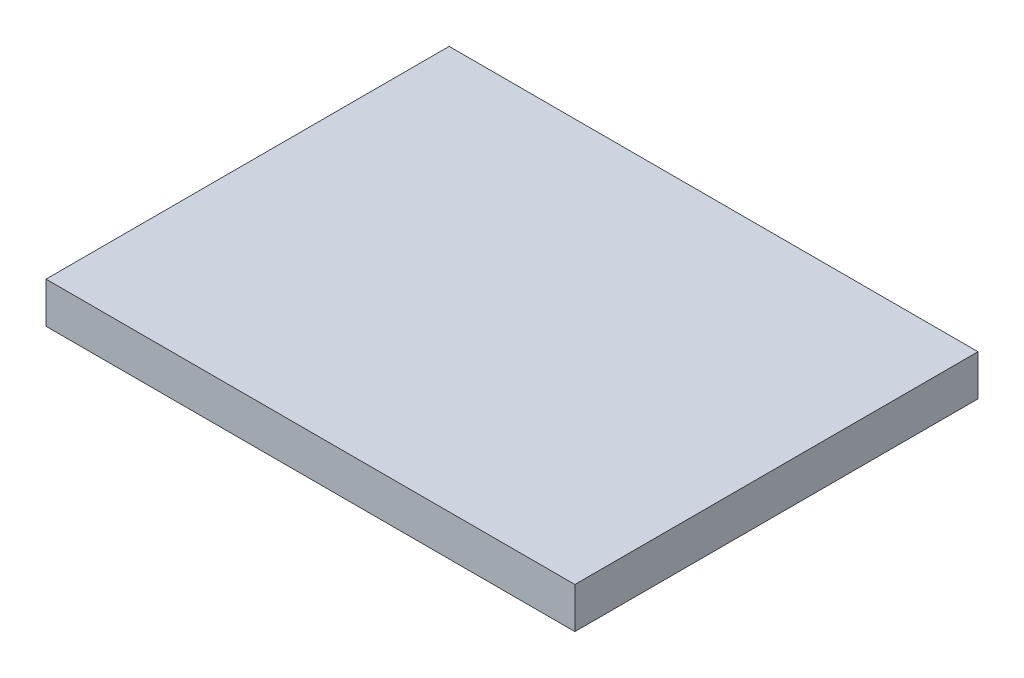
ISO-10303-21;
HEADER;
FILE_DESCRIPTION(('STEP AP214'),'2;1');
FILE_NAME('part.step','',(''),(''),'','','');
FILE_SCHEMA(('AUTOMOTIVE_DESIGN { 1 0 10303 214 1 1 1 1 }'));
ENDSEC;
DATA;
#1=APPLICATION_CONTEXT('core data for automotive mechanical design processes');
#2=APPLICATION_PROTOCOL_DEFINITION('international standard','automotive_design',2000,#1);
#3=PRODUCT_CONTEXT('',#1,'mechanical');
#4=PRODUCT('Part','Part','',(#3));
#5=PRODUCT_RELATED_PRODUCT_CATEGORY('part','',(#4));
#6=PRODUCT_DEFINITION_FORMATION('','',#4);
#7=PRODUCT_DEFINITION_CONTEXT('part definition',#1,'design');
#8=PRODUCT_DEFINITION('design','',#6,#7);
#9=PRODUCT_DEFINITION_SHAPE('','',#8);
#10=(LENGTH_UNIT() NAMED_UNIT(*) SI_UNIT(.MILLI.,.METRE.));
#11=(NAMED_UNIT(*) PLANE_ANGLE_UNIT() SI_UNIT($,.RADIAN.));
#12=(NAMED_UNIT(*) SI_UNIT($,.STERADIAN.) SOLID_ANGLE_UNIT());
#13=UNCERTAINTY_MEASURE_WITH_UNIT(LENGTH_MEASURE(1.E-05),#10,'distance_accuracy_value','');
#14=(GEOMETRIC_REPRESENTATION_CONTEXT(3) GLOBAL_UNCERTAINTY_ASSIGNED_CONTEXT((#13)) GLOBAL_UNIT_ASSIGNED_CONTEXT((#10,
#11,#12)) REPRESENTATION_CONTEXT('',''));
#15=CARTESIAN_POINT('',(0.,0.,0.));
#16=DIRECTION('',(0.,0.,1.));
#17=DIRECTION('',(1.,0.,0.));
#18=AXIS2_PLACEMENT_3D('',#15,#16,#17);
#19=CARTESIAN_POINT('',(64.7574629951211,10.,49.3605836815958));
#20=DIRECTION('',(-1.,0.,0.));
#21=DIRECTION('',(0.,0.,1.));
#22=AXIS2_PLACEMENT_3D('',#19,#20,#21);
#23=PLANE('',#22);
#24=DIRECTION('',(0.,0.,-1.));
#25=VECTOR('',#24,1.);
#26=CARTESIAN_POINT('',(64.7574629951211,0.,49.3605836815958));
#27=LINE('',#26,#25);
#28=CARTESIAN_POINT('',(64.7574629951211,0.,49.3605836815958));
#29=VERTEX_POINT('',#28);
#30=CARTESIAN_POINT('',(64.7574629951211,0.,-49.3605836815958));
#31=VERTEX_POINT('',#30);
#32=EDGE_CURVE('E100',#29,#31,#27,.T.);
#33=ORIENTED_EDGE('',*,*,#32,.T.);
#34=DIRECTION('',(0.,-1.,0.));
#35=VECTOR('',#34,1.);
#36=CARTESIAN_POINT('',(64.7574629951211,10.,-49.3605836815958));
#37=LINE('',#36,#35);
#38=CARTESIAN_POINT('',(64.7574629951211,10.,-49.3605836815958));
#39=VERTEX_POINT('',#38);
#40=EDGE_CURVE('E11',#39,#31,#37,.T.);
#41=ORIENTED_EDGE('',*,*,#40,.F.);
#42=DIRECTION('',(0.,0.,-1.));
#43=VECTOR('',#42,1.);
#44=CARTESIAN_POINT('',(64.7574629951211,10.,49.3605836815958));
#45=LINE('',#44,#43);
#46=CARTESIAN_POINT('',(64.7574629951211,10.,49.3605836815958));
#47=VERTEX_POINT('',#46);
#48=EDGE_CURVE('E88',#47,#39,#45,.T.);
#49=ORIENTED_EDGE('',*,*,#48,.F.);
#50=DIRECTION('',(0.,-1.,0.));
#51=VECTOR('',#50,1.);
#52=CARTESIAN_POINT('',(64.7574629951211,10.,49.3605836815958));
#53=LINE('',#52,#51);
#54=EDGE_CURVE('E96',#47,#29,#53,.T.);
#55=ORIENTED_EDGE('',*,*,#54,.T.);
#56=EDGE_LOOP('',(#33,#41,#49,#55));
#57=FACE_BOUND('',#56,.T.);
#58=ADVANCED_FACE('F37',(#57),#23,.F.);
#59=CARTESIAN_POINT('',(-64.7574629951211,10.,-49.3605836815958));
#60=DIRECTION('',(0.,0.,1.));
#61=DIRECTION('',(1.,0.,0.));
#62=AXIS2_PLACEMENT_3D('',#59,#60,#61);
#63=PLANE('',#62);
#64=DIRECTION('',(-1.,0.,0.));
#65=VECTOR('',#64,1.);
#66=CARTESIAN_POINT('',(-64.7574629951211,0.,-49.3605836815958));
#67=LINE('',#66,#65);
#68=CARTESIAN_POINT('',(-64.7574629951211,0.,-49.3605836815958));
#69=VERTEX_POINT('',#68);
#70=EDGE_CURVE('E92',#31,#69,#67,.T.);
#71=ORIENTED_EDGE('',*,*,#70,.T.);
#72=DIRECTION('',(0.,-1.,0.));
#73=VECTOR('',#72,1.);
#74=CARTESIAN_POINT('',(-64.7574629951211,10.,-49.3605836815958));
#75=LINE('',#74,#73);
#76=CARTESIAN_POINT('',(-64.7574629951211,10.,-49.3605836815958));
#77=VERTEX_POINT('',#76);
#78=EDGE_CURVE('E45',#77,#69,#75,.T.);
#79=ORIENTED_EDGE('',*,*,#78,.F.);
#80=DIRECTION('',(-1.,0.,0.));
#81=VECTOR('',#80,1.);
#82=CARTESIAN_POINT('',(-64.7574629951211,10.,-49.3605836815958));
#83=LINE('',#82,#81);
#84=EDGE_CURVE('E83',#39,#77,#83,.T.);
#85=ORIENTED_EDGE('',*,*,#84,.F.);
#86=ORIENTED_EDGE('',*,*,#40,.T.);
#87=EDGE_LOOP('',(#71,#79,#85,#86));
#88=FACE_BOUND('',#87,.T.);
#89=ADVANCED_FACE('F91',(#88),#63,.F.);
#90=CARTESIAN_POINT('',(-64.7574629951211,10.,49.3605836815958));
#91=DIRECTION('',(1.,0.,0.));
#92=DIRECTION('',(0.,0.,-1.));
#93=AXIS2_PLACEMENT_3D('',#90,#91,#92);
#94=PLANE('',#93);
#95=DIRECTION('',(0.,0.,1.));
#96=VECTOR('',#95,1.);
#97=CARTESIAN_POINT('',(-64.7574629951211,0.,49.3605836815958));
#98=LINE('',#97,#96);
#99=CARTESIAN_POINT('',(-64.7574629951211,0.,49.3605836815958));
#100=VERTEX_POINT('',#99);
#101=EDGE_CURVE('E70',#69,#100,#98,.T.);
#102=ORIENTED_EDGE('',*,*,#101,.T.);
#103=DIRECTION('',(0.,-1.,0.));
#104=VECTOR('',#103,1.);
#105=CARTESIAN_POINT('',(-64.7574629951211,10.,49.3605836815958));
#106=LINE('',#105,#104);
#107=CARTESIAN_POINT('',(-64.7574629951211,10.,49.3605836815958));
#108=VERTEX_POINT('',#107);
#109=EDGE_CURVE('E93',#108,#100,#106,.T.);
#110=ORIENTED_EDGE('',*,*,#109,.F.);
#111=DIRECTION('',(0.,0.,1.));
#112=VECTOR('',#111,1.);
#113=CARTESIAN_POINT('',(-64.7574629951211,10.,49.3605836815958));
#114=LINE('',#113,#112);
#115=EDGE_CURVE('E86',#77,#108,#114,.T.);
#116=ORIENTED_EDGE('',*,*,#115,.F.);
#117=ORIENTED_EDGE('',*,*,#78,.T.);
#118=EDGE_LOOP('',(#102,#110,#116,#117));
#119=FACE_BOUND('',#118,.T.);
#120=ADVANCED_FACE('F94',(#119),#94,.F.);
#121=CARTESIAN_POINT('',(-64.7574629951211,10.,49.3605836815958));
#122=DIRECTION('',(0.,0.,-1.));
#123=DIRECTION('',(-1.,0.,0.));
#124=AXIS2_PLACEMENT_3D('',#121,#122,#123);
#125=PLANE('',#124);
#126=DIRECTION('',(1.,0.,0.));
#127=VECTOR('',#126,1.);
#128=CARTESIAN_POINT('',(-64.7574629951211,0.,49.3605836815958));
#129=LINE('',#128,#127);
#130=EDGE_CURVE('E76',#100,#29,#129,.T.);
#131=ORIENTED_EDGE('',*,*,#130,.T.);
#132=ORIENTED_EDGE('',*,*,#54,.F.);
#133=DIRECTION('',(1.,0.,0.));
#134=VECTOR('',#133,1.);
#135=CARTESIAN_POINT('',(-64.7574629951211,10.,49.3605836815958));
#136=LINE('',#135,#134);
#137=EDGE_CURVE('E53',#108,#47,#136,.T.);
#138=ORIENTED_EDGE('',*,*,#137,.F.);
#139=ORIENTED_EDGE('',*,*,#109,.T.);
#140=EDGE_LOOP('',(#131,#132,#138,#139));
#141=FACE_BOUND('',#140,.T.);
#142=ADVANCED_FACE('F107',(#141),#125,.F.);
#143=CARTESIAN_POINT('',(0.,10.,0.));
#144=DIRECTION('',(0.,-1.,0.));
#145=DIRECTION('',(0.,0.,-1.));
#146=AXIS2_PLACEMENT_3D('',#143,#144,#145);
#147=PLANE('',#146);
#148=ORIENTED_EDGE('',*,*,#48,.T.);
#149=ORIENTED_EDGE('',*,*,#84,.T.);
#150=ORIENTED_EDGE('',*,*,#115,.T.);
#151=ORIENTED_EDGE('',*,*,#137,.T.);
#152=EDGE_LOOP('',(#148,#149,#150,#151));
#153=FACE_BOUND('',#152,.T.);
#154=ADVANCED_FACE('F84',(#153),#147,.F.);
#155=CARTESIAN_POINT('',(0.,0.,0.));
#156=DIRECTION('',(0.,-1.,0.));
#157=DIRECTION('',(0.,0.,-1.));
#158=AXIS2_PLACEMENT_3D('',#155,#156,#157);
#159=PLANE('',#158);
#160=ORIENTED_EDGE('',*,*,#32,.F.);
#161=ORIENTED_EDGE('',*,*,#130,.F.);
#162=ORIENTED_EDGE('',*,*,#101,.F.);
#163=ORIENTED_EDGE('',*,*,#70,.F.);
#164=EDGE_LOOP('',(#160,#161,#162,#163));
#165=FACE_BOUND('',#164,.T.);
#166=ADVANCED_FACE('F110',(#165),#159,.T.);
#167=CLOSED_SHELL('',(#58,#89,#120,#142,#154,#166));
#168=MANIFOLD_SOLID_BREP('B2',#167);
#169=ADVANCED_BREP_SHAPE_REPRESENTATION('',(#18,#168),#14);
#170=SHAPE_DEFINITION_REPRESENTATION(#9,#169);
ENDSEC;
END-ISO-10303-21;
